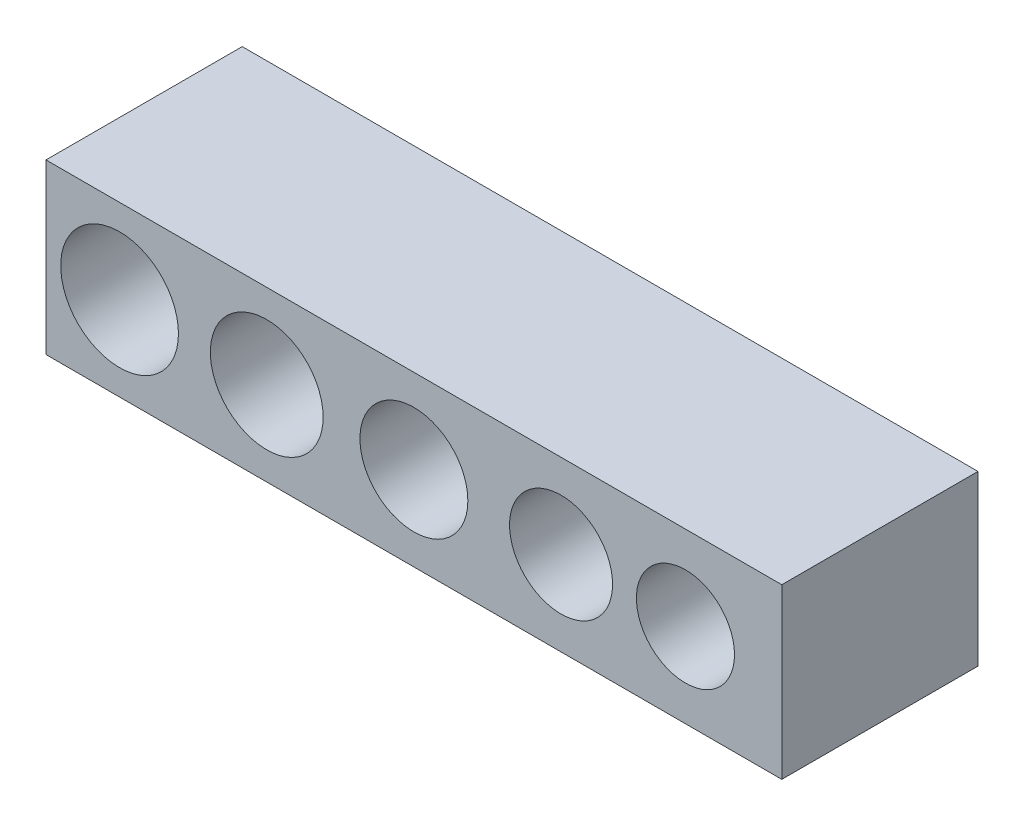
ISO-10303-21;
HEADER;
FILE_DESCRIPTION(('STEP AP214'),'2;1');
FILE_NAME('part.step','',(''),(''),'','','');
FILE_SCHEMA(('AUTOMOTIVE_DESIGN { 1 0 10303 214 1 1 1 1 }'));
ENDSEC;
DATA;
#1=APPLICATION_CONTEXT('core data for automotive mechanical design processes');
#2=APPLICATION_PROTOCOL_DEFINITION('international standard','automotive_design',2000,#1);
#3=PRODUCT_CONTEXT('',#1,'mechanical');
#4=PRODUCT('Part','Part','',(#3));
#5=PRODUCT_RELATED_PRODUCT_CATEGORY('part','',(#4));
#6=PRODUCT_DEFINITION_FORMATION('','',#4);
#7=PRODUCT_DEFINITION_CONTEXT('part definition',#1,'design');
#8=PRODUCT_DEFINITION('design','',#6,#7);
#9=PRODUCT_DEFINITION_SHAPE('','',#8);
#10=(LENGTH_UNIT() NAMED_UNIT(*) SI_UNIT(.MILLI.,.METRE.));
#11=(NAMED_UNIT(*) PLANE_ANGLE_UNIT() SI_UNIT($,.RADIAN.));
#12=(NAMED_UNIT(*) SI_UNIT($,.STERADIAN.) SOLID_ANGLE_UNIT());
#13=UNCERTAINTY_MEASURE_WITH_UNIT(LENGTH_MEASURE(1.E-05),#10,'distance_accuracy_value','');
#14=(GEOMETRIC_REPRESENTATION_CONTEXT(3) GLOBAL_UNCERTAINTY_ASSIGNED_CONTEXT((#13)) GLOBAL_UNIT_ASSIGNED_CONTEXT((#10,
#11,#12)) REPRESENTATION_CONTEXT('',''));
#15=CARTESIAN_POINT('',(0.,0.,0.));
#16=DIRECTION('',(0.,0.,1.));
#17=DIRECTION('',(1.,0.,0.));
#18=AXIS2_PLACEMENT_3D('',#15,#16,#17);
#19=CARTESIAN_POINT('',(0.,-1.7185975357165,4.));
#20=DIRECTION('',(0.,1.,0.));
#21=DIRECTION('',(0.,0.,1.));
#22=AXIS2_PLACEMENT_3D('',#19,#20,#21);
#23=PLANE('',#22);
#24=DIRECTION('',(1.,0.,0.));
#25=VECTOR('',#24,1.);
#26=CARTESIAN_POINT('',(0.,-1.7185975357165,0.));
#27=LINE('',#26,#25);
#28=CARTESIAN_POINT('',(-7.5,-1.7185975357165,0.));
#29=VERTEX_POINT('',#28);
#30=CARTESIAN_POINT('',(7.5,-1.7185975357165,0.));
#31=VERTEX_POINT('',#30);
#32=EDGE_CURVE('E128',#29,#31,#27,.T.);
#33=ORIENTED_EDGE('',*,*,#32,.T.);
#34=DIRECTION('',(0.,0.,-1.));
#35=VECTOR('',#34,1.);
#36=CARTESIAN_POINT('',(7.5,-1.7185975357165,4.));
#37=LINE('',#36,#35);
#38=CARTESIAN_POINT('',(7.5,-1.7185975357165,4.));
#39=VERTEX_POINT('',#38);
#40=EDGE_CURVE('E11',#39,#31,#37,.T.);
#41=ORIENTED_EDGE('',*,*,#40,.F.);
#42=DIRECTION('',(1.,0.,0.));
#43=VECTOR('',#42,1.);
#44=CARTESIAN_POINT('',(0.,-1.7185975357165,4.));
#45=LINE('',#44,#43);
#46=CARTESIAN_POINT('',(-7.5,-1.7185975357165,4.));
#47=VERTEX_POINT('',#46);
#48=EDGE_CURVE('E90',#47,#39,#45,.T.);
#49=ORIENTED_EDGE('',*,*,#48,.F.);
#50=DIRECTION('',(0.,0.,-1.));
#51=VECTOR('',#50,1.);
#52=CARTESIAN_POINT('',(-7.5,-1.7185975357165,4.));
#53=LINE('',#52,#51);
#54=EDGE_CURVE('E57',#47,#29,#53,.T.);
#55=ORIENTED_EDGE('',*,*,#54,.T.);
#56=EDGE_LOOP('',(#33,#41,#49,#55));
#57=FACE_BOUND('',#56,.T.);
#58=ADVANCED_FACE('F39',(#57),#23,.F.);
#59=CARTESIAN_POINT('',(7.5,0.,4.));
#60=DIRECTION('',(-1.,0.,0.));
#61=DIRECTION('',(0.,0.,1.));
#62=AXIS2_PLACEMENT_3D('',#59,#60,#61);
#63=PLANE('',#62);
#64=DIRECTION('',(0.,1.,0.));
#65=VECTOR('',#64,1.);
#66=CARTESIAN_POINT('',(7.5,0.,0.));
#67=LINE('',#66,#65);
#68=CARTESIAN_POINT('',(7.5,1.7185975357165,0.));
#69=VERTEX_POINT('',#68);
#70=EDGE_CURVE('E96',#31,#69,#67,.T.);
#71=ORIENTED_EDGE('',*,*,#70,.T.);
#72=DIRECTION('',(0.,0.,-1.));
#73=VECTOR('',#72,1.);
#74=CARTESIAN_POINT('',(7.5,1.7185975357165,4.));
#75=LINE('',#74,#73);
#76=CARTESIAN_POINT('',(7.5,1.7185975357165,4.));
#77=VERTEX_POINT('',#76);
#78=EDGE_CURVE('E49',#77,#69,#75,.T.);
#79=ORIENTED_EDGE('',*,*,#78,.F.);
#80=DIRECTION('',(0.,1.,0.));
#81=VECTOR('',#80,1.);
#82=CARTESIAN_POINT('',(7.5,0.,4.));
#83=LINE('',#82,#81);
#84=EDGE_CURVE('E82',#39,#77,#83,.T.);
#85=ORIENTED_EDGE('',*,*,#84,.F.);
#86=ORIENTED_EDGE('',*,*,#40,.T.);
#87=EDGE_LOOP('',(#71,#79,#85,#86));
#88=FACE_BOUND('',#87,.T.);
#89=ADVANCED_FACE('F95',(#88),#63,.F.);
#90=CARTESIAN_POINT('',(0.,1.7185975357165,4.));
#91=DIRECTION('',(0.,1.,0.));
#92=DIRECTION('',(0.,0.,1.));
#93=AXIS2_PLACEMENT_3D('',#90,#91,#92);
#94=PLANE('',#93);
#95=DIRECTION('',(1.,0.,0.));
#96=VECTOR('',#95,1.);
#97=CARTESIAN_POINT('',(0.,1.7185975357165,0.));
#98=LINE('',#97,#96);
#99=CARTESIAN_POINT('',(-7.5,1.7185975357165,0.));
#100=VERTEX_POINT('',#99);
#101=EDGE_CURVE('E133',#100,#69,#98,.T.);
#102=ORIENTED_EDGE('',*,*,#101,.F.);
#103=DIRECTION('',(0.,0.,-1.));
#104=VECTOR('',#103,1.);
#105=CARTESIAN_POINT('',(-7.5,1.7185975357165,4.));
#106=LINE('',#105,#104);
#107=CARTESIAN_POINT('',(-7.5,1.7185975357165,4.));
#108=VERTEX_POINT('',#107);
#109=EDGE_CURVE('E71',#108,#100,#106,.T.);
#110=ORIENTED_EDGE('',*,*,#109,.F.);
#111=DIRECTION('',(1.,0.,0.));
#112=VECTOR('',#111,1.);
#113=CARTESIAN_POINT('',(0.,1.7185975357165,4.));
#114=LINE('',#113,#112);
#115=EDGE_CURVE('E89',#108,#77,#114,.T.);
#116=ORIENTED_EDGE('',*,*,#115,.T.);
#117=ORIENTED_EDGE('',*,*,#78,.T.);
#118=EDGE_LOOP('',(#102,#110,#116,#117));
#119=FACE_BOUND('',#118,.T.);
#120=ADVANCED_FACE('F100',(#119),#94,.T.);
#121=CARTESIAN_POINT('',(0.,0.,4.));
#122=DIRECTION('',(0.,0.,-1.));
#123=DIRECTION('',(-1.,0.,0.));
#124=AXIS2_PLACEMENT_3D('',#121,#122,#123);
#125=CYLINDRICAL_SURFACE('',#124,1.1);
#126=CARTESIAN_POINT('',(0.,0.,4.));
#127=DIRECTION('',(0.,0.,1.));
#128=DIRECTION('',(1.,0.,0.));
#129=AXIS2_PLACEMENT_3D('',#126,#127,#128);
#130=CIRCLE('',#129,1.1);
#131=CARTESIAN_POINT('',(1.1,0.,4.));
#132=VERTEX_POINT('',#131);
#133=EDGE_CURVE('E163',#132,#132,#130,.T.);
#134=ORIENTED_EDGE('',*,*,#133,.T.);
#135=EDGE_LOOP('',(#134));
#136=FACE_BOUND('',#135,.T.);
#137=CARTESIAN_POINT('',(0.,0.,0.));
#138=DIRECTION('',(0.,0.,1.));
#139=DIRECTION('',(1.,0.,0.));
#140=AXIS2_PLACEMENT_3D('',#137,#138,#139);
#141=CIRCLE('',#140,1.1);
#142=CARTESIAN_POINT('',(1.1,0.,0.));
#143=VERTEX_POINT('',#142);
#144=EDGE_CURVE('E124',#143,#143,#141,.T.);
#145=ORIENTED_EDGE('',*,*,#144,.F.);
#146=EDGE_LOOP('',(#145));
#147=FACE_BOUND('',#146,.T.);
#148=ADVANCED_FACE('F169',(#136,#147),#125,.F.);
#149=CARTESIAN_POINT('',(-3.,0.,4.));
#150=DIRECTION('',(0.,0.,-1.));
#151=DIRECTION('',(-1.,0.,0.));
#152=AXIS2_PLACEMENT_3D('',#149,#150,#151);
#153=CYLINDRICAL_SURFACE('',#152,1.15);
#154=CARTESIAN_POINT('',(-3.,0.,4.));
#155=DIRECTION('',(0.,0.,1.));
#156=DIRECTION('',(1.,0.,0.));
#157=AXIS2_PLACEMENT_3D('',#154,#155,#156);
#158=CIRCLE('',#157,1.15);
#159=CARTESIAN_POINT('',(-1.85,0.,4.));
#160=VERTEX_POINT('',#159);
#161=EDGE_CURVE('E159',#160,#160,#158,.T.);
#162=ORIENTED_EDGE('',*,*,#161,.T.);
#163=EDGE_LOOP('',(#162));
#164=FACE_BOUND('',#163,.T.);
#165=CARTESIAN_POINT('',(-3.,0.,0.));
#166=DIRECTION('',(0.,0.,1.));
#167=DIRECTION('',(1.,0.,0.));
#168=AXIS2_PLACEMENT_3D('',#165,#166,#167);
#169=CIRCLE('',#168,1.15);
#170=CARTESIAN_POINT('',(-1.85,0.,0.));
#171=VERTEX_POINT('',#170);
#172=EDGE_CURVE('E120',#171,#171,#169,.T.);
#173=ORIENTED_EDGE('',*,*,#172,.F.);
#174=EDGE_LOOP('',(#173));
#175=FACE_BOUND('',#174,.T.);
#176=ADVANCED_FACE('F195',(#164,#175),#153,.F.);
#177=CARTESIAN_POINT('',(3.,0.,4.));
#178=DIRECTION('',(0.,0.,-1.));
#179=DIRECTION('',(-1.,0.,0.));
#180=AXIS2_PLACEMENT_3D('',#177,#178,#179);
#181=CYLINDRICAL_SURFACE('',#180,1.05);
#182=CARTESIAN_POINT('',(3.,0.,4.));
#183=DIRECTION('',(0.,0.,1.));
#184=DIRECTION('',(1.,0.,0.));
#185=AXIS2_PLACEMENT_3D('',#182,#183,#184);
#186=CIRCLE('',#185,1.05);
#187=CARTESIAN_POINT('',(4.05,0.,4.));
#188=VERTEX_POINT('',#187);
#189=EDGE_CURVE('E153',#188,#188,#186,.T.);
#190=ORIENTED_EDGE('',*,*,#189,.T.);
#191=EDGE_LOOP('',(#190));
#192=FACE_BOUND('',#191,.T.);
#193=CARTESIAN_POINT('',(3.,0.,0.));
#194=DIRECTION('',(0.,0.,1.));
#195=DIRECTION('',(1.,0.,0.));
#196=AXIS2_PLACEMENT_3D('',#193,#194,#195);
#197=CIRCLE('',#196,1.05);
#198=CARTESIAN_POINT('',(4.05,0.,0.));
#199=VERTEX_POINT('',#198);
#200=EDGE_CURVE('E116',#199,#199,#197,.T.);
#201=ORIENTED_EDGE('',*,*,#200,.F.);
#202=EDGE_LOOP('',(#201));
#203=FACE_BOUND('',#202,.T.);
#204=ADVANCED_FACE('F198',(#192,#203),#181,.F.);
#205=CARTESIAN_POINT('',(5.53605700442011,0.,4.));
#206=DIRECTION('',(0.,0.,-1.));
#207=DIRECTION('',(-1.,0.,0.));
#208=AXIS2_PLACEMENT_3D('',#205,#206,#207);
#209=CYLINDRICAL_SURFACE('',#208,1.);
#210=CARTESIAN_POINT('',(5.53605700442011,0.,4.));
#211=DIRECTION('',(0.,0.,1.));
#212=DIRECTION('',(1.,0.,0.));
#213=AXIS2_PLACEMENT_3D('',#210,#211,#212);
#214=CIRCLE('',#213,1.);
#215=CARTESIAN_POINT('',(6.53605700442011,0.,4.));
#216=VERTEX_POINT('',#215);
#217=EDGE_CURVE('E147',#216,#216,#214,.T.);
#218=ORIENTED_EDGE('',*,*,#217,.T.);
#219=EDGE_LOOP('',(#218));
#220=FACE_BOUND('',#219,.T.);
#221=CARTESIAN_POINT('',(5.53605700442011,0.,0.));
#222=DIRECTION('',(0.,0.,1.));
#223=DIRECTION('',(1.,0.,0.));
#224=AXIS2_PLACEMENT_3D('',#221,#222,#223);
#225=CIRCLE('',#224,1.);
#226=CARTESIAN_POINT('',(6.53605700442011,0.,0.));
#227=VERTEX_POINT('',#226);
#228=EDGE_CURVE('E112',#227,#227,#225,.T.);
#229=ORIENTED_EDGE('',*,*,#228,.F.);
#230=EDGE_LOOP('',(#229));
#231=FACE_BOUND('',#230,.T.);
#232=ADVANCED_FACE('F201',(#220,#231),#209,.F.);
#233=CARTESIAN_POINT('',(-6.,0.,4.));
#234=DIRECTION('',(0.,0.,-1.));
#235=DIRECTION('',(-1.,0.,0.));
#236=AXIS2_PLACEMENT_3D('',#233,#234,#235);
#237=CYLINDRICAL_SURFACE('',#236,1.2);
#238=CARTESIAN_POINT('',(-6.,0.,4.));
#239=DIRECTION('',(0.,0.,1.));
#240=DIRECTION('',(1.,0.,0.));
#241=AXIS2_PLACEMENT_3D('',#238,#239,#240);
#242=CIRCLE('',#241,1.2);
#243=CARTESIAN_POINT('',(-4.8,0.,4.));
#244=VERTEX_POINT('',#243);
#245=EDGE_CURVE('E140',#244,#244,#242,.T.);
#246=ORIENTED_EDGE('',*,*,#245,.T.);
#247=EDGE_LOOP('',(#246));
#248=FACE_BOUND('',#247,.T.);
#249=CARTESIAN_POINT('',(-6.,0.,0.));
#250=DIRECTION('',(0.,0.,1.));
#251=DIRECTION('',(1.,0.,0.));
#252=AXIS2_PLACEMENT_3D('',#249,#250,#251);
#253=CIRCLE('',#252,1.2);
#254=CARTESIAN_POINT('',(-4.8,0.,0.));
#255=VERTEX_POINT('',#254);
#256=EDGE_CURVE('E108',#255,#255,#253,.T.);
#257=ORIENTED_EDGE('',*,*,#256,.F.);
#258=EDGE_LOOP('',(#257));
#259=FACE_BOUND('',#258,.T.);
#260=ADVANCED_FACE('F41',(#248,#259),#237,.F.);
#261=CARTESIAN_POINT('',(-7.5,0.,4.));
#262=DIRECTION('',(-1.,0.,0.));
#263=DIRECTION('',(0.,0.,1.));
#264=AXIS2_PLACEMENT_3D('',#261,#262,#263);
#265=PLANE('',#264);
#266=DIRECTION('',(0.,1.,0.));
#267=VECTOR('',#266,1.);
#268=CARTESIAN_POINT('',(-7.5,0.,0.));
#269=LINE('',#268,#267);
#270=EDGE_CURVE('E136',#29,#100,#269,.T.);
#271=ORIENTED_EDGE('',*,*,#270,.F.);
#272=ORIENTED_EDGE('',*,*,#54,.F.);
#273=DIRECTION('',(0.,1.,0.));
#274=VECTOR('',#273,1.);
#275=CARTESIAN_POINT('',(-7.5,0.,4.));
#276=LINE('',#275,#274);
#277=EDGE_CURVE('E102',#47,#108,#276,.T.);
#278=ORIENTED_EDGE('',*,*,#277,.T.);
#279=ORIENTED_EDGE('',*,*,#109,.T.);
#280=EDGE_LOOP('',(#271,#272,#278,#279));
#281=FACE_BOUND('',#280,.T.);
#282=ADVANCED_FACE('F174',(#281),#265,.T.);
#283=CARTESIAN_POINT('',(0.,0.,4.));
#284=DIRECTION('',(0.,0.,1.));
#285=DIRECTION('',(1.,0.,0.));
#286=AXIS2_PLACEMENT_3D('',#283,#284,#285);
#287=PLANE('',#286);
#288=ORIENTED_EDGE('',*,*,#245,.F.);
#289=EDGE_LOOP('',(#288));
#290=FACE_BOUND('',#289,.T.);
#291=ORIENTED_EDGE('',*,*,#217,.F.);
#292=EDGE_LOOP('',(#291));
#293=FACE_BOUND('',#292,.T.);
#294=ORIENTED_EDGE('',*,*,#189,.F.);
#295=EDGE_LOOP('',(#294));
#296=FACE_BOUND('',#295,.T.);
#297=ORIENTED_EDGE('',*,*,#161,.F.);
#298=EDGE_LOOP('',(#297));
#299=FACE_BOUND('',#298,.T.);
#300=ORIENTED_EDGE('',*,*,#133,.F.);
#301=EDGE_LOOP('',(#300));
#302=FACE_BOUND('',#301,.T.);
#303=ORIENTED_EDGE('',*,*,#48,.T.);
#304=ORIENTED_EDGE('',*,*,#84,.T.);
#305=ORIENTED_EDGE('',*,*,#115,.F.);
#306=ORIENTED_EDGE('',*,*,#277,.F.);
#307=EDGE_LOOP('',(#303,#304,#305,#306));
#308=FACE_BOUND('',#307,.T.);
#309=ADVANCED_FACE('F86',(#290,#293,#296,#299,#302,#308),#287,.T.);
#310=CARTESIAN_POINT('',(0.,0.,0.));
#311=DIRECTION('',(0.,0.,1.));
#312=DIRECTION('',(1.,0.,0.));
#313=AXIS2_PLACEMENT_3D('',#310,#311,#312);
#314=PLANE('',#313);
#315=ORIENTED_EDGE('',*,*,#256,.T.);
#316=EDGE_LOOP('',(#315));
#317=FACE_BOUND('',#316,.T.);
#318=ORIENTED_EDGE('',*,*,#228,.T.);
#319=EDGE_LOOP('',(#318));
#320=FACE_BOUND('',#319,.T.);
#321=ORIENTED_EDGE('',*,*,#200,.T.);
#322=EDGE_LOOP('',(#321));
#323=FACE_BOUND('',#322,.T.);
#324=ORIENTED_EDGE('',*,*,#172,.T.);
#325=EDGE_LOOP('',(#324));
#326=FACE_BOUND('',#325,.T.);
#327=ORIENTED_EDGE('',*,*,#144,.T.);
#328=EDGE_LOOP('',(#327));
#329=FACE_BOUND('',#328,.T.);
#330=ORIENTED_EDGE('',*,*,#32,.F.);
#331=ORIENTED_EDGE('',*,*,#270,.T.);
#332=ORIENTED_EDGE('',*,*,#101,.T.);
#333=ORIENTED_EDGE('',*,*,#70,.F.);
#334=EDGE_LOOP('',(#330,#331,#332,#333));
#335=FACE_BOUND('',#334,.T.);
#336=ADVANCED_FACE('F173',(#317,#320,#323,#326,#329,#335),#314,.F.);
#337=CLOSED_SHELL('',(#58,#89,#120,#148,#176,#204,#232,#260,#282,#309,#336));
#338=MANIFOLD_SOLID_BREP('B2',#337);
#339=ADVANCED_BREP_SHAPE_REPRESENTATION('',(#18,#338),#14);
#340=SHAPE_DEFINITION_REPRESENTATION(#9,#339);
ENDSEC;
END-ISO-10303-21;
